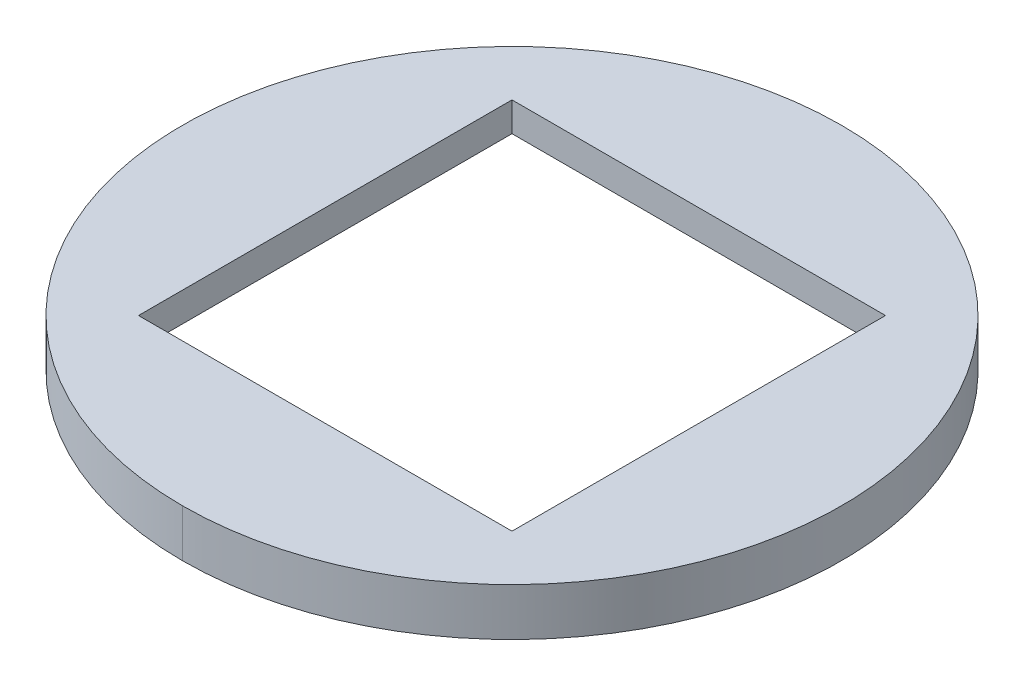
ISO-10303-21;
HEADER;
FILE_DESCRIPTION(('STEP AP214'),'2;1');
FILE_NAME('part.step','',(''),(''),'','','');
FILE_SCHEMA(('AUTOMOTIVE_DESIGN { 1 0 10303 214 1 1 1 1 }'));
ENDSEC;
DATA;
#1=APPLICATION_CONTEXT('core data for automotive mechanical design processes');
#2=APPLICATION_PROTOCOL_DEFINITION('international standard','automotive_design',2000,#1);
#3=PRODUCT_CONTEXT('',#1,'mechanical');
#4=PRODUCT('Part','Part','',(#3));
#5=PRODUCT_RELATED_PRODUCT_CATEGORY('part','',(#4));
#6=PRODUCT_DEFINITION_FORMATION('','',#4);
#7=PRODUCT_DEFINITION_CONTEXT('part definition',#1,'design');
#8=PRODUCT_DEFINITION('design','',#6,#7);
#9=PRODUCT_DEFINITION_SHAPE('','',#8);
#10=(LENGTH_UNIT() NAMED_UNIT(*) SI_UNIT(.MILLI.,.METRE.));
#11=(NAMED_UNIT(*) PLANE_ANGLE_UNIT() SI_UNIT($,.RADIAN.));
#12=(NAMED_UNIT(*) SI_UNIT($,.STERADIAN.) SOLID_ANGLE_UNIT());
#13=UNCERTAINTY_MEASURE_WITH_UNIT(LENGTH_MEASURE(1.E-05),#10,'distance_accuracy_value','');
#14=(GEOMETRIC_REPRESENTATION_CONTEXT(3) GLOBAL_UNCERTAINTY_ASSIGNED_CONTEXT((#13)) GLOBAL_UNIT_ASSIGNED_CONTEXT((#10,
#11,#12)) REPRESENTATION_CONTEXT('',''));
#15=CARTESIAN_POINT('',(0.,0.,0.));
#16=DIRECTION('',(0.,0.,1.));
#17=DIRECTION('',(1.,0.,0.));
#18=AXIS2_PLACEMENT_3D('',#15,#16,#17);
#19=CARTESIAN_POINT('',(0.,-0.5,0.));
#20=DIRECTION('',(0.,1.,0.));
#21=DIRECTION('',(0.,0.,1.));
#22=AXIS2_PLACEMENT_3D('',#19,#20,#21);
#23=CYLINDRICAL_SURFACE('',#22,8.9);
#24=DIRECTION('',(0.,1.,0.));
#25=VECTOR('',#24,1.);
#26=CARTESIAN_POINT('',(0.,-0.5,-8.9));
#27=LINE('',#26,#25);
#28=CARTESIAN_POINT('',(0.,-0.5,-8.9));
#29=VERTEX_POINT('',#28);
#30=CARTESIAN_POINT('',(0.,0.,-8.9));
#31=VERTEX_POINT('',#30);
#32=EDGE_CURVE('E19',#29,#31,#27,.T.);
#33=ORIENTED_EDGE('',*,*,#32,.F.);
#34=CARTESIAN_POINT('',(0.,-0.5,0.));
#35=DIRECTION('',(0.,1.,0.));
#36=DIRECTION('',(0.,0.,1.));
#37=AXIS2_PLACEMENT_3D('',#34,#35,#36);
#38=CIRCLE('',#37,8.9);
#39=CARTESIAN_POINT('',(0.,-0.5,8.9));
#40=VERTEX_POINT('',#39);
#41=EDGE_CURVE('E11',#40,#29,#38,.T.);
#42=ORIENTED_EDGE('',*,*,#41,.F.);
#43=DIRECTION('',(0.,1.,0.));
#44=VECTOR('',#43,1.);
#45=CARTESIAN_POINT('',(0.,-0.5,8.9));
#46=LINE('',#45,#44);
#47=CARTESIAN_POINT('',(0.,0.,8.9));
#48=VERTEX_POINT('',#47);
#49=EDGE_CURVE('E195',#40,#48,#46,.T.);
#50=ORIENTED_EDGE('',*,*,#49,.T.);
#51=CARTESIAN_POINT('',(0.,0.,0.));
#52=DIRECTION('',(0.,1.,0.));
#53=DIRECTION('',(0.,0.,1.));
#54=AXIS2_PLACEMENT_3D('',#51,#52,#53);
#55=CIRCLE('',#54,8.9);
#56=EDGE_CURVE('E26',#48,#31,#55,.T.);
#57=ORIENTED_EDGE('',*,*,#56,.T.);
#58=EDGE_LOOP('',(#33,#42,#50,#57));
#59=FACE_BOUND('',#58,.T.);
#60=ADVANCED_FACE('F16',(#59),#23,.F.);
#61=CARTESIAN_POINT('',(0.,-0.5,0.));
#62=DIRECTION('',(0.,-1.,0.));
#63=DIRECTION('',(0.,0.,-1.));
#64=AXIS2_PLACEMENT_3D('',#61,#62,#63);
#65=PLANE('',#64);
#66=ORIENTED_EDGE('',*,*,#41,.T.);
#67=CARTESIAN_POINT('',(0.,-0.5,0.));
#68=DIRECTION('',(0.,1.,0.));
#69=DIRECTION('',(0.,0.,1.));
#70=AXIS2_PLACEMENT_3D('',#67,#68,#69);
#71=CIRCLE('',#70,8.9);
#72=EDGE_CURVE('E180',#29,#40,#71,.T.);
#73=ORIENTED_EDGE('',*,*,#72,.T.);
#74=EDGE_LOOP('',(#66,#73));
#75=FACE_BOUND('',#74,.T.);
#76=CARTESIAN_POINT('',(0.,-0.5,0.));
#77=DIRECTION('',(0.,1.,0.));
#78=DIRECTION('',(0.,0.,-1.));
#79=AXIS2_PLACEMENT_3D('',#76,#77,#78);
#80=CIRCLE('',#79,9.);
#81=CARTESIAN_POINT('',(0.,-0.5,-9.));
#82=VERTEX_POINT('',#81);
#83=CARTESIAN_POINT('',(0.,-0.5,9.));
#84=VERTEX_POINT('',#83);
#85=EDGE_CURVE('E154',#82,#84,#80,.T.);
#86=ORIENTED_EDGE('',*,*,#85,.F.);
#87=CARTESIAN_POINT('',(0.,-0.5,0.));
#88=DIRECTION('',(0.,1.,0.));
#89=DIRECTION('',(0.,0.,-1.));
#90=AXIS2_PLACEMENT_3D('',#87,#88,#89);
#91=CIRCLE('',#90,9.);
#92=EDGE_CURVE('E172',#84,#82,#91,.T.);
#93=ORIENTED_EDGE('',*,*,#92,.F.);
#94=EDGE_LOOP('',(#86,#93));
#95=FACE_BOUND('',#94,.T.);
#96=ADVANCED_FACE('F223',(#75,#95),#65,.T.);
#97=CARTESIAN_POINT('',(0.,0.,0.));
#98=DIRECTION('',(0.,1.,0.));
#99=DIRECTION('',(1.,0.,0.));
#100=AXIS2_PLACEMENT_3D('',#97,#98,#99);
#101=PLANE('',#100);
#102=DIRECTION('',(1.,0.,0.));
#103=VECTOR('',#102,1.);
#104=CARTESIAN_POINT('',(-5.1,0.,-5.1));
#105=LINE('',#104,#103);
#106=CARTESIAN_POINT('',(-5.1,0.,-5.1));
#107=VERTEX_POINT('',#106);
#108=CARTESIAN_POINT('',(5.1,0.,-5.1));
#109=VERTEX_POINT('',#108);
#110=EDGE_CURVE('E40',#107,#109,#105,.T.);
#111=ORIENTED_EDGE('',*,*,#110,.F.);
#112=DIRECTION('',(0.,0.,-1.));
#113=VECTOR('',#112,1.);
#114=CARTESIAN_POINT('',(-5.1,0.,5.1));
#115=LINE('',#114,#113);
#116=CARTESIAN_POINT('',(-5.1,0.,5.1));
#117=VERTEX_POINT('',#116);
#118=EDGE_CURVE('E134',#117,#107,#115,.T.);
#119=ORIENTED_EDGE('',*,*,#118,.F.);
#120=DIRECTION('',(-1.,0.,0.));
#121=VECTOR('',#120,1.);
#122=CARTESIAN_POINT('',(-5.1,0.,5.1));
#123=LINE('',#122,#121);
#124=CARTESIAN_POINT('',(5.1,0.,5.1));
#125=VERTEX_POINT('',#124);
#126=EDGE_CURVE('E127',#125,#117,#123,.T.);
#127=ORIENTED_EDGE('',*,*,#126,.F.);
#128=DIRECTION('',(0.,0.,1.));
#129=VECTOR('',#128,1.);
#130=CARTESIAN_POINT('',(5.1,0.,5.1));
#131=LINE('',#130,#129);
#132=EDGE_CURVE('E156',#109,#125,#131,.T.);
#133=ORIENTED_EDGE('',*,*,#132,.F.);
#134=EDGE_LOOP('',(#111,#119,#127,#133));
#135=FACE_BOUND('',#134,.T.);
#136=ORIENTED_EDGE('',*,*,#56,.F.);
#137=CARTESIAN_POINT('',(0.,0.,0.));
#138=DIRECTION('',(0.,1.,0.));
#139=DIRECTION('',(0.,0.,1.));
#140=AXIS2_PLACEMENT_3D('',#137,#138,#139);
#141=CIRCLE('',#140,8.9);
#142=EDGE_CURVE('E191',#31,#48,#141,.T.);
#143=ORIENTED_EDGE('',*,*,#142,.F.);
#144=EDGE_LOOP('',(#136,#143));
#145=FACE_BOUND('',#144,.T.);
#146=ADVANCED_FACE('F135',(#135,#145),#101,.F.);
#147=CARTESIAN_POINT('',(0.,0.8,0.));
#148=DIRECTION('',(0.,-1.,0.));
#149=DIRECTION('',(0.,0.,-1.));
#150=AXIS2_PLACEMENT_3D('',#147,#148,#149);
#151=CYLINDRICAL_SURFACE('',#150,9.);
#152=DIRECTION('',(0.,-1.,0.));
#153=VECTOR('',#152,1.);
#154=CARTESIAN_POINT('',(0.,0.8,9.));
#155=LINE('',#154,#153);
#156=CARTESIAN_POINT('',(0.,0.8,9.));
#157=VERTEX_POINT('',#156);
#158=EDGE_CURVE('E170',#157,#84,#155,.T.);
#159=ORIENTED_EDGE('',*,*,#158,.F.);
#160=CARTESIAN_POINT('',(0.,0.8,0.));
#161=DIRECTION('',(0.,1.,0.));
#162=DIRECTION('',(0.,0.,-1.));
#163=AXIS2_PLACEMENT_3D('',#160,#161,#162);
#164=CIRCLE('',#163,9.);
#165=CARTESIAN_POINT('',(0.,0.8,-9.));
#166=VERTEX_POINT('',#165);
#167=EDGE_CURVE('E199',#166,#157,#164,.T.);
#168=ORIENTED_EDGE('',*,*,#167,.F.);
#169=DIRECTION('',(0.,-1.,0.));
#170=VECTOR('',#169,1.);
#171=CARTESIAN_POINT('',(0.,0.8,-9.));
#172=LINE('',#171,#170);
#173=EDGE_CURVE('E183',#166,#82,#172,.T.);
#174=ORIENTED_EDGE('',*,*,#173,.T.);
#175=ORIENTED_EDGE('',*,*,#85,.T.);
#176=EDGE_LOOP('',(#159,#168,#174,#175));
#177=FACE_BOUND('',#176,.T.);
#178=ADVANCED_FACE('F228',(#177),#151,.T.);
#179=CARTESIAN_POINT('',(-5.1,0.8,-5.1));
#180=DIRECTION('',(0.,0.,1.));
#181=DIRECTION('',(1.,0.,0.));
#182=AXIS2_PLACEMENT_3D('',#179,#180,#181);
#183=PLANE('',#182);
#184=DIRECTION('',(1.,0.,0.));
#185=VECTOR('',#184,1.);
#186=CARTESIAN_POINT('',(0.,0.8,-5.1));
#187=LINE('',#186,#185);
#188=CARTESIAN_POINT('',(-5.1,0.8,-5.1));
#189=VERTEX_POINT('',#188);
#190=CARTESIAN_POINT('',(5.1,0.8,-5.1));
#191=VERTEX_POINT('',#190);
#192=EDGE_CURVE('E151',#189,#191,#187,.T.);
#193=ORIENTED_EDGE('',*,*,#192,.F.);
#194=DIRECTION('',(0.,1.,0.));
#195=VECTOR('',#194,1.);
#196=CARTESIAN_POINT('',(-5.1,0.8,-5.1));
#197=LINE('',#196,#195);
#198=EDGE_CURVE('E99',#107,#189,#197,.T.);
#199=ORIENTED_EDGE('',*,*,#198,.F.);
#200=ORIENTED_EDGE('',*,*,#110,.T.);
#201=DIRECTION('',(0.,-1.,0.));
#202=VECTOR('',#201,1.);
#203=CARTESIAN_POINT('',(5.1,0.8,-5.1));
#204=LINE('',#203,#202);
#205=EDGE_CURVE('E132',#191,#109,#204,.T.);
#206=ORIENTED_EDGE('',*,*,#205,.F.);
#207=EDGE_LOOP('',(#193,#199,#200,#206));
#208=FACE_BOUND('',#207,.T.);
#209=ADVANCED_FACE('F264',(#208),#183,.T.);
#210=CARTESIAN_POINT('',(5.1,0.8,5.1));
#211=DIRECTION('',(-1.,0.,0.));
#212=DIRECTION('',(0.,0.,1.));
#213=AXIS2_PLACEMENT_3D('',#210,#211,#212);
#214=PLANE('',#213);
#215=DIRECTION('',(0.,0.,1.));
#216=VECTOR('',#215,1.);
#217=CARTESIAN_POINT('',(5.1,0.8,0.));
#218=LINE('',#217,#216);
#219=CARTESIAN_POINT('',(5.1,0.8,5.1));
#220=VERTEX_POINT('',#219);
#221=EDGE_CURVE('E144',#191,#220,#218,.T.);
#222=ORIENTED_EDGE('',*,*,#221,.F.);
#223=ORIENTED_EDGE('',*,*,#205,.T.);
#224=ORIENTED_EDGE('',*,*,#132,.T.);
#225=DIRECTION('',(0.,-1.,0.));
#226=VECTOR('',#225,1.);
#227=CARTESIAN_POINT('',(5.1,0.8,5.1));
#228=LINE('',#227,#226);
#229=EDGE_CURVE('E119',#220,#125,#228,.T.);
#230=ORIENTED_EDGE('',*,*,#229,.F.);
#231=EDGE_LOOP('',(#222,#223,#224,#230));
#232=FACE_BOUND('',#231,.T.);
#233=ADVANCED_FACE('F268',(#232),#214,.T.);
#234=CARTESIAN_POINT('',(-5.1,0.8,5.1));
#235=DIRECTION('',(0.,0.,-1.));
#236=DIRECTION('',(0.,-1.,0.));
#237=AXIS2_PLACEMENT_3D('',#234,#235,#236);
#238=PLANE('',#237);
#239=DIRECTION('',(-1.,0.,0.));
#240=VECTOR('',#239,1.);
#241=CARTESIAN_POINT('',(0.,0.8,5.1));
#242=LINE('',#241,#240);
#243=CARTESIAN_POINT('',(-5.1,0.8,5.1));
#244=VERTEX_POINT('',#243);
#245=EDGE_CURVE('E189',#220,#244,#242,.T.);
#246=ORIENTED_EDGE('',*,*,#245,.F.);
#247=ORIENTED_EDGE('',*,*,#229,.T.);
#248=ORIENTED_EDGE('',*,*,#126,.T.);
#249=DIRECTION('',(0.,-1.,0.));
#250=VECTOR('',#249,1.);
#251=CARTESIAN_POINT('',(-5.1,0.8,5.1));
#252=LINE('',#251,#250);
#253=EDGE_CURVE('E108',#244,#117,#252,.T.);
#254=ORIENTED_EDGE('',*,*,#253,.F.);
#255=EDGE_LOOP('',(#246,#247,#248,#254));
#256=FACE_BOUND('',#255,.T.);
#257=ADVANCED_FACE('F129',(#256),#238,.T.);
#258=CARTESIAN_POINT('',(-5.1,0.8,5.1));
#259=DIRECTION('',(1.,0.,0.));
#260=DIRECTION('',(0.,1.,0.));
#261=AXIS2_PLACEMENT_3D('',#258,#259,#260);
#262=PLANE('',#261);
#263=DIRECTION('',(0.,0.,-1.));
#264=VECTOR('',#263,1.);
#265=CARTESIAN_POINT('',(-5.1,0.8,0.));
#266=LINE('',#265,#264);
#267=EDGE_CURVE('E141',#244,#189,#266,.T.);
#268=ORIENTED_EDGE('',*,*,#267,.F.);
#269=ORIENTED_EDGE('',*,*,#253,.T.);
#270=ORIENTED_EDGE('',*,*,#118,.T.);
#271=ORIENTED_EDGE('',*,*,#198,.T.);
#272=EDGE_LOOP('',(#268,#269,#270,#271));
#273=FACE_BOUND('',#272,.T.);
#274=ADVANCED_FACE('F139',(#273),#262,.T.);
#275=CARTESIAN_POINT('',(0.,0.8,0.));
#276=DIRECTION('',(0.,1.,0.));
#277=DIRECTION('',(1.,0.,0.));
#278=AXIS2_PLACEMENT_3D('',#275,#276,#277);
#279=PLANE('',#278);
#280=ORIENTED_EDGE('',*,*,#245,.T.);
#281=ORIENTED_EDGE('',*,*,#267,.T.);
#282=ORIENTED_EDGE('',*,*,#192,.T.);
#283=ORIENTED_EDGE('',*,*,#221,.T.);
#284=EDGE_LOOP('',(#280,#281,#282,#283));
#285=FACE_BOUND('',#284,.T.);
#286=ORIENTED_EDGE('',*,*,#167,.T.);
#287=CARTESIAN_POINT('',(0.,0.8,0.));
#288=DIRECTION('',(0.,1.,0.));
#289=DIRECTION('',(0.,0.,-1.));
#290=AXIS2_PLACEMENT_3D('',#287,#288,#289);
#291=CIRCLE('',#290,9.);
#292=EDGE_CURVE('E173',#157,#166,#291,.T.);
#293=ORIENTED_EDGE('',*,*,#292,.T.);
#294=EDGE_LOOP('',(#286,#293));
#295=FACE_BOUND('',#294,.T.);
#296=ADVANCED_FACE('F258',(#285,#295),#279,.T.);
#297=CARTESIAN_POINT('',(0.,-0.5,0.));
#298=DIRECTION('',(0.,1.,0.));
#299=DIRECTION('',(0.,0.,1.));
#300=AXIS2_PLACEMENT_3D('',#297,#298,#299);
#301=CYLINDRICAL_SURFACE('',#300,8.9);
#302=ORIENTED_EDGE('',*,*,#72,.F.);
#303=ORIENTED_EDGE('',*,*,#32,.T.);
#304=ORIENTED_EDGE('',*,*,#142,.T.);
#305=ORIENTED_EDGE('',*,*,#49,.F.);
#306=EDGE_LOOP('',(#302,#303,#304,#305));
#307=FACE_BOUND('',#306,.T.);
#308=ADVANCED_FACE('F254',(#307),#301,.F.);
#309=CARTESIAN_POINT('',(0.,0.8,0.));
#310=DIRECTION('',(0.,-1.,0.));
#311=DIRECTION('',(0.,0.,-1.));
#312=AXIS2_PLACEMENT_3D('',#309,#310,#311);
#313=CYLINDRICAL_SURFACE('',#312,9.);
#314=ORIENTED_EDGE('',*,*,#292,.F.);
#315=ORIENTED_EDGE('',*,*,#158,.T.);
#316=ORIENTED_EDGE('',*,*,#92,.T.);
#317=ORIENTED_EDGE('',*,*,#173,.F.);
#318=EDGE_LOOP('',(#314,#315,#316,#317));
#319=FACE_BOUND('',#318,.T.);
#320=ADVANCED_FACE('F221',(#319),#313,.T.);
#321=CLOSED_SHELL('',(#60,#96,#146,#178,#209,#233,#257,#274,#296,#308,#320));
#322=MANIFOLD_SOLID_BREP('B1',#321);
#323=ADVANCED_BREP_SHAPE_REPRESENTATION('',(#18,#322),#14);
#324=SHAPE_DEFINITION_REPRESENTATION(#9,#323);
ENDSEC;
END-ISO-10303-21;
